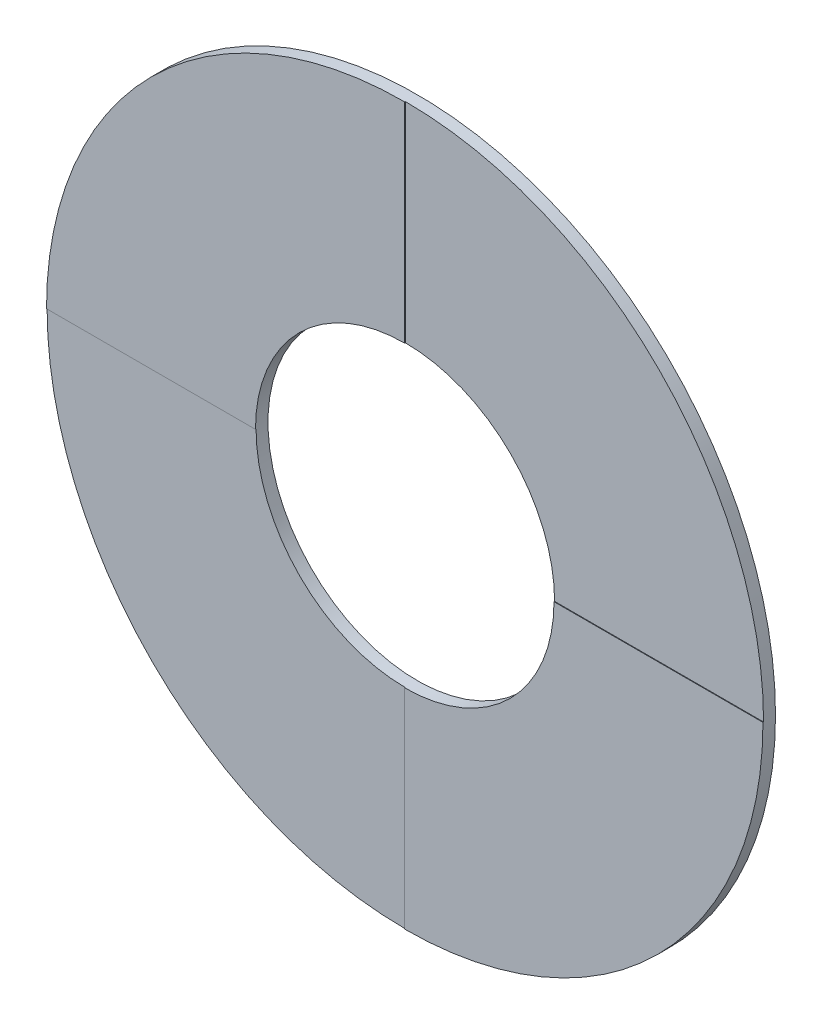
ISO-10303-21;
HEADER;
FILE_DESCRIPTION(('STEP AP214'),'2;1');
FILE_NAME('part.step','',(''),(''),'','','');
FILE_SCHEMA(('AUTOMOTIVE_DESIGN { 1 0 10303 214 1 1 1 1 }'));
ENDSEC;
DATA;
#1=APPLICATION_CONTEXT('core data for automotive mechanical design processes');
#2=APPLICATION_PROTOCOL_DEFINITION('international standard','automotive_design',2000,#1);
#3=PRODUCT_CONTEXT('',#1,'mechanical');
#4=PRODUCT('Part','Part','',(#3));
#5=PRODUCT_RELATED_PRODUCT_CATEGORY('part','',(#4));
#6=PRODUCT_DEFINITION_FORMATION('','',#4);
#7=PRODUCT_DEFINITION_CONTEXT('part definition',#1,'design');
#8=PRODUCT_DEFINITION('design','',#6,#7);
#9=PRODUCT_DEFINITION_SHAPE('','',#8);
#10=(LENGTH_UNIT() NAMED_UNIT(*) SI_UNIT(.MILLI.,.METRE.));
#11=(NAMED_UNIT(*) PLANE_ANGLE_UNIT() SI_UNIT($,.RADIAN.));
#12=(NAMED_UNIT(*) SI_UNIT($,.STERADIAN.) SOLID_ANGLE_UNIT());
#13=UNCERTAINTY_MEASURE_WITH_UNIT(LENGTH_MEASURE(1.E-05),#10,'distance_accuracy_value','');
#14=(GEOMETRIC_REPRESENTATION_CONTEXT(3) GLOBAL_UNCERTAINTY_ASSIGNED_CONTEXT((#13)) GLOBAL_UNIT_ASSIGNED_CONTEXT((#10,
#11,#12)) REPRESENTATION_CONTEXT('',''));
#15=CARTESIAN_POINT('',(0.,0.,0.));
#16=DIRECTION('',(0.,0.,1.));
#17=DIRECTION('',(1.,0.,0.));
#18=AXIS2_PLACEMENT_3D('',#15,#16,#17);
#19=CARTESIAN_POINT('',(-15.22823902556,-4.489944657592,5.5));
#20=DIRECTION('',(-1.,0.,0.));
#21=DIRECTION('',(0.,0.,1.));
#22=AXIS2_PLACEMENT_3D('',#19,#20,#21);
#23=PLANE('',#22);
#24=DIRECTION('',(0.,1.,0.));
#25=VECTOR('',#24,1.);
#26=CARTESIAN_POINT('',(-15.22823902556,0.,5.7));
#27=LINE('',#26,#25);
#28=CARTESIAN_POINT('',(-15.22823902556,-4.489944657592,5.7));
#29=VERTEX_POINT('',#28);
#30=CARTESIAN_POINT('',(-15.22823902556,-0.989944657592,5.7));
#31=VERTEX_POINT('',#30);
#32=EDGE_CURVE('E104',#29,#31,#27,.T.);
#33=ORIENTED_EDGE('',*,*,#32,.F.);
#34=DIRECTION('',(0.,0.,1.));
#35=VECTOR('',#34,1.);
#36=CARTESIAN_POINT('',(-15.22823902556,-4.489944657592,5.5));
#37=LINE('',#36,#35);
#38=CARTESIAN_POINT('',(-15.22823902556,-4.489944657592,5.71));
#39=VERTEX_POINT('',#38);
#40=EDGE_CURVE('E132',#29,#39,#37,.T.);
#41=ORIENTED_EDGE('',*,*,#40,.T.);
#42=DIRECTION('',(0.,1.,0.));
#43=VECTOR('',#42,1.);
#44=CARTESIAN_POINT('',(-15.22823902556,0.,5.71));
#45=LINE('',#44,#43);
#46=CARTESIAN_POINT('',(-15.22823902556,-0.989944657592,5.71));
#47=VERTEX_POINT('',#46);
#48=EDGE_CURVE('E124',#39,#47,#45,.T.);
#49=ORIENTED_EDGE('',*,*,#48,.T.);
#50=DIRECTION('',(0.,0.,1.));
#51=VECTOR('',#50,1.);
#52=CARTESIAN_POINT('',(-15.22823902556,-0.989944657592,5.5));
#53=LINE('',#52,#51);
#54=EDGE_CURVE('E135',#47,#31,#53,.F.);
#55=ORIENTED_EDGE('',*,*,#54,.T.);
#56=EDGE_LOOP('',(#33,#41,#49,#55));
#57=FACE_BOUND('',#56,.T.);
#58=ADVANCED_FACE('F16',(#57),#23,.T.);
#59=CARTESIAN_POINT('',(-17.72823902556,1.510055342408,5.5));
#60=DIRECTION('',(0.,-1.,0.));
#61=DIRECTION('',(0.,0.,-1.));
#62=AXIS2_PLACEMENT_3D('',#59,#60,#61);
#63=PLANE('',#62);
#64=DIRECTION('',(-1.,0.,0.));
#65=VECTOR('',#64,1.);
#66=CARTESIAN_POINT('',(0.,1.510055342408,5.71));
#67=LINE('',#66,#65);
#68=CARTESIAN_POINT('',(-17.72823902556,1.510055342408,5.71));
#69=VERTEX_POINT('',#68);
#70=CARTESIAN_POINT('',(-21.22823902556,1.510055342408,5.71));
#71=VERTEX_POINT('',#70);
#72=EDGE_CURVE('E103',#69,#71,#67,.T.);
#73=ORIENTED_EDGE('',*,*,#72,.T.);
#74=DIRECTION('',(0.,0.,-1.));
#75=VECTOR('',#74,1.);
#76=CARTESIAN_POINT('',(-21.22823902556,1.510055342408,5.5));
#77=LINE('',#76,#75);
#78=CARTESIAN_POINT('',(-21.22823902556,1.510055342408,5.7));
#79=VERTEX_POINT('',#78);
#80=EDGE_CURVE('E129',#71,#79,#77,.T.);
#81=ORIENTED_EDGE('',*,*,#80,.T.);
#82=DIRECTION('',(1.,0.,0.));
#83=VECTOR('',#82,1.);
#84=CARTESIAN_POINT('',(0.,1.510055342408,5.7));
#85=LINE('',#84,#83);
#86=CARTESIAN_POINT('',(-17.72823902556,1.510055342408,5.7));
#87=VERTEX_POINT('',#86);
#88=EDGE_CURVE('E119',#87,#79,#85,.F.);
#89=ORIENTED_EDGE('',*,*,#88,.F.);
#90=DIRECTION('',(0.,0.,-1.));
#91=VECTOR('',#90,1.);
#92=CARTESIAN_POINT('',(-17.72823902556,1.510055342408,5.5));
#93=LINE('',#92,#91);
#94=EDGE_CURVE('E78',#87,#69,#93,.F.);
#95=ORIENTED_EDGE('',*,*,#94,.T.);
#96=EDGE_LOOP('',(#73,#81,#89,#95));
#97=FACE_BOUND('',#96,.T.);
#98=ADVANCED_FACE('F244',(#97),#63,.T.);
#99=CARTESIAN_POINT('',(-15.22823902556,7.510055342408,5.5));
#100=DIRECTION('',(1.,0.,0.));
#101=DIRECTION('',(0.,0.,-1.));
#102=AXIS2_PLACEMENT_3D('',#99,#100,#101);
#103=PLANE('',#102);
#104=DIRECTION('',(0.,1.,0.));
#105=VECTOR('',#104,1.);
#106=CARTESIAN_POINT('',(-15.22823902556,0.,5.71));
#107=LINE('',#106,#105);
#108=CARTESIAN_POINT('',(-15.22823902556,7.510055342408,5.71));
#109=VERTEX_POINT('',#108);
#110=CARTESIAN_POINT('',(-15.22823902556,4.010055342408,5.71));
#111=VERTEX_POINT('',#110);
#112=EDGE_CURVE('E98',#109,#111,#107,.F.);
#113=ORIENTED_EDGE('',*,*,#112,.T.);
#114=DIRECTION('',(0.,0.,-1.));
#115=VECTOR('',#114,1.);
#116=CARTESIAN_POINT('',(-15.22823902556,4.010055342408,5.5));
#117=LINE('',#116,#115);
#118=CARTESIAN_POINT('',(-15.22823902556,4.010055342408,5.7));
#119=VERTEX_POINT('',#118);
#120=EDGE_CURVE('E84',#111,#119,#117,.T.);
#121=ORIENTED_EDGE('',*,*,#120,.T.);
#122=DIRECTION('',(0.,1.,0.));
#123=VECTOR('',#122,1.);
#124=CARTESIAN_POINT('',(-15.22823902556,0.,5.7));
#125=LINE('',#124,#123);
#126=CARTESIAN_POINT('',(-15.22823902556,7.510055342408,5.7));
#127=VERTEX_POINT('',#126);
#128=EDGE_CURVE('E109',#127,#119,#125,.F.);
#129=ORIENTED_EDGE('',*,*,#128,.F.);
#130=DIRECTION('',(0.,0.,-1.));
#131=VECTOR('',#130,1.);
#132=CARTESIAN_POINT('',(-15.22823902556,7.510055342408,5.5));
#133=LINE('',#132,#131);
#134=EDGE_CURVE('E95',#127,#109,#133,.F.);
#135=ORIENTED_EDGE('',*,*,#134,.T.);
#136=EDGE_LOOP('',(#113,#121,#129,#135));
#137=FACE_BOUND('',#136,.T.);
#138=ADVANCED_FACE('F99',(#137),#103,.T.);
#139=CARTESIAN_POINT('',(-12.72823902556,1.510055342408,5.5));
#140=DIRECTION('',(0.,1.,0.));
#141=DIRECTION('',(0.,0.,1.));
#142=AXIS2_PLACEMENT_3D('',#139,#140,#141);
#143=PLANE('',#142);
#144=DIRECTION('',(-1.,0.,0.));
#145=VECTOR('',#144,1.);
#146=CARTESIAN_POINT('',(0.,1.510055342408,5.71));
#147=LINE('',#146,#145);
#148=CARTESIAN_POINT('',(-12.72823902556,1.510055342408,5.71));
#149=VERTEX_POINT('',#148);
#150=CARTESIAN_POINT('',(-9.22823902556025,1.510055342408,5.71));
#151=VERTEX_POINT('',#150);
#152=EDGE_CURVE('E122',#149,#151,#147,.F.);
#153=ORIENTED_EDGE('',*,*,#152,.T.);
#154=DIRECTION('',(0.,0.,1.));
#155=VECTOR('',#154,1.);
#156=CARTESIAN_POINT('',(-9.2282390255605,1.510055342408,5.5));
#157=LINE('',#156,#155);
#158=CARTESIAN_POINT('',(-9.22823902556025,1.510055342408,5.7));
#159=VERTEX_POINT('',#158);
#160=EDGE_CURVE('E34',#151,#159,#157,.F.);
#161=ORIENTED_EDGE('',*,*,#160,.T.);
#162=DIRECTION('',(1.,0.,0.));
#163=VECTOR('',#162,1.);
#164=CARTESIAN_POINT('',(0.,1.510055342408,5.7));
#165=LINE('',#164,#163);
#166=CARTESIAN_POINT('',(-12.72823902556,1.510055342408,5.7));
#167=VERTEX_POINT('',#166);
#168=EDGE_CURVE('E107',#167,#159,#165,.T.);
#169=ORIENTED_EDGE('',*,*,#168,.F.);
#170=DIRECTION('',(0.,0.,1.));
#171=VECTOR('',#170,1.);
#172=CARTESIAN_POINT('',(-12.72823902556,1.510055342408,5.5));
#173=LINE('',#172,#171);
#174=EDGE_CURVE('E94',#167,#149,#173,.T.);
#175=ORIENTED_EDGE('',*,*,#174,.T.);
#176=EDGE_LOOP('',(#153,#161,#169,#175));
#177=FACE_BOUND('',#176,.T.);
#178=ADVANCED_FACE('F166',(#177),#143,.T.);
#179=CARTESIAN_POINT('',(0.,0.,5.71));
#180=DIRECTION('',(0.,0.,-1.));
#181=DIRECTION('',(-1.,0.,0.));
#182=AXIS2_PLACEMENT_3D('',#179,#180,#181);
#183=PLANE('',#182);
#184=ORIENTED_EDGE('',*,*,#152,.F.);
#185=CARTESIAN_POINT('',(-15.22823902556,1.510055342408,5.71));
#186=DIRECTION('',(0.,0.,1.));
#187=DIRECTION('',(1.,0.,0.));
#188=AXIS2_PLACEMENT_3D('',#185,#186,#187);
#189=CIRCLE('',#188,2.5);
#190=EDGE_CURVE('E108',#149,#47,#189,.F.);
#191=ORIENTED_EDGE('',*,*,#190,.T.);
#192=ORIENTED_EDGE('',*,*,#48,.F.);
#193=CARTESIAN_POINT('',(-15.22823902556,1.510055342408,5.71));
#194=DIRECTION('',(0.,0.,1.));
#195=DIRECTION('',(1.,0.,0.));
#196=AXIS2_PLACEMENT_3D('',#193,#194,#195);
#197=CIRCLE('',#196,6.);
#198=EDGE_CURVE('E146',#151,#39,#197,.F.);
#199=ORIENTED_EDGE('',*,*,#198,.F.);
#200=EDGE_LOOP('',(#184,#191,#192,#199));
#201=FACE_BOUND('',#200,.T.);
#202=ADVANCED_FACE('F157',(#201),#183,.F.);
#203=CARTESIAN_POINT('',(0.,0.,5.7));
#204=DIRECTION('',(0.,0.,1.));
#205=DIRECTION('',(1.,0.,0.));
#206=AXIS2_PLACEMENT_3D('',#203,#204,#205);
#207=PLANE('',#206);
#208=CARTESIAN_POINT('',(-15.22823902556,1.510055342408,5.7));
#209=DIRECTION('',(0.,0.,1.));
#210=DIRECTION('',(1.,0.,0.));
#211=AXIS2_PLACEMENT_3D('',#208,#209,#210);
#212=CIRCLE('',#211,6.);
#213=EDGE_CURVE('E143',#29,#79,#212,.F.);
#214=ORIENTED_EDGE('',*,*,#213,.F.);
#215=ORIENTED_EDGE('',*,*,#32,.T.);
#216=CARTESIAN_POINT('',(-15.22823902556,1.510055342408,5.7));
#217=DIRECTION('',(0.,0.,1.));
#218=DIRECTION('',(1.,0.,0.));
#219=AXIS2_PLACEMENT_3D('',#216,#217,#218);
#220=CIRCLE('',#219,2.5);
#221=EDGE_CURVE('E149',#31,#87,#220,.F.);
#222=ORIENTED_EDGE('',*,*,#221,.T.);
#223=ORIENTED_EDGE('',*,*,#88,.T.);
#224=EDGE_LOOP('',(#214,#215,#222,#223));
#225=FACE_BOUND('',#224,.T.);
#226=ADVANCED_FACE('F176',(#225),#207,.T.);
#227=CARTESIAN_POINT('',(0.,0.,5.71));
#228=DIRECTION('',(0.,0.,-1.));
#229=DIRECTION('',(-1.,0.,0.));
#230=AXIS2_PLACEMENT_3D('',#227,#228,#229);
#231=PLANE('',#230);
#232=CARTESIAN_POINT('',(-15.22823902556,1.510055342408,5.71));
#233=DIRECTION('',(0.,0.,1.));
#234=DIRECTION('',(1.,0.,0.));
#235=AXIS2_PLACEMENT_3D('',#232,#233,#234);
#236=CIRCLE('',#235,2.5);
#237=EDGE_CURVE('E19',#69,#111,#236,.F.);
#238=ORIENTED_EDGE('',*,*,#237,.T.);
#239=ORIENTED_EDGE('',*,*,#112,.F.);
#240=CARTESIAN_POINT('',(-15.22823902556,1.510055342408,5.71));
#241=DIRECTION('',(0.,0.,1.));
#242=DIRECTION('',(1.,0.,0.));
#243=AXIS2_PLACEMENT_3D('',#240,#241,#242);
#244=CIRCLE('',#243,6.);
#245=EDGE_CURVE('E141',#71,#109,#244,.F.);
#246=ORIENTED_EDGE('',*,*,#245,.F.);
#247=ORIENTED_EDGE('',*,*,#72,.F.);
#248=EDGE_LOOP('',(#238,#239,#246,#247));
#249=FACE_BOUND('',#248,.T.);
#250=ADVANCED_FACE('F106',(#249),#231,.F.);
#251=CARTESIAN_POINT('',(0.,0.,5.7));
#252=DIRECTION('',(0.,0.,1.));
#253=DIRECTION('',(1.,0.,0.));
#254=AXIS2_PLACEMENT_3D('',#251,#252,#253);
#255=PLANE('',#254);
#256=CARTESIAN_POINT('',(-15.22823902556,1.510055342408,5.7));
#257=DIRECTION('',(0.,0.,1.));
#258=DIRECTION('',(1.,0.,0.));
#259=AXIS2_PLACEMENT_3D('',#256,#257,#258);
#260=CIRCLE('',#259,2.5);
#261=EDGE_CURVE('E90',#119,#167,#260,.F.);
#262=ORIENTED_EDGE('',*,*,#261,.T.);
#263=ORIENTED_EDGE('',*,*,#168,.T.);
#264=CARTESIAN_POINT('',(-15.22823902556,1.510055342408,5.7));
#265=DIRECTION('',(0.,0.,1.));
#266=DIRECTION('',(1.,0.,0.));
#267=AXIS2_PLACEMENT_3D('',#264,#265,#266);
#268=CIRCLE('',#267,6.);
#269=EDGE_CURVE('E139',#127,#159,#268,.F.);
#270=ORIENTED_EDGE('',*,*,#269,.F.);
#271=ORIENTED_EDGE('',*,*,#128,.T.);
#272=EDGE_LOOP('',(#262,#263,#270,#271));
#273=FACE_BOUND('',#272,.T.);
#274=ADVANCED_FACE('F167',(#273),#255,.T.);
#275=CARTESIAN_POINT('',(-15.22823902556,1.510055342408,5.5));
#276=DIRECTION('',(0.,0.,1.));
#277=DIRECTION('',(1.,0.,0.));
#278=AXIS2_PLACEMENT_3D('',#275,#276,#277);
#279=CYLINDRICAL_SURFACE('',#278,2.5);
#280=ORIENTED_EDGE('',*,*,#174,.F.);
#281=ORIENTED_EDGE('',*,*,#261,.F.);
#282=ORIENTED_EDGE('',*,*,#120,.F.);
#283=ORIENTED_EDGE('',*,*,#237,.F.);
#284=ORIENTED_EDGE('',*,*,#94,.F.);
#285=ORIENTED_EDGE('',*,*,#221,.F.);
#286=ORIENTED_EDGE('',*,*,#54,.F.);
#287=ORIENTED_EDGE('',*,*,#190,.F.);
#288=EDGE_LOOP('',(#280,#281,#282,#283,#284,#285,#286,#287));
#289=FACE_BOUND('',#288,.T.);
#290=CARTESIAN_POINT('',(-15.22823902556,1.510055342408,5.5));
#291=DIRECTION('',(0.,0.,1.));
#292=DIRECTION('',(1.,0.,0.));
#293=AXIS2_PLACEMENT_3D('',#290,#291,#292);
#294=CIRCLE('',#293,2.5);
#295=CARTESIAN_POINT('',(-12.72823902556,1.510055342408,5.5));
#296=VERTEX_POINT('',#295);
#297=EDGE_CURVE('E25',#296,#296,#294,.F.);
#298=ORIENTED_EDGE('',*,*,#297,.T.);
#299=EDGE_LOOP('',(#298));
#300=FACE_BOUND('',#299,.T.);
#301=ADVANCED_FACE('F86',(#289,#300),#279,.F.);
#302=CARTESIAN_POINT('',(-15.22823902556,1.510055342408,5.5));
#303=DIRECTION('',(0.,0.,1.));
#304=DIRECTION('',(1.,0.,0.));
#305=AXIS2_PLACEMENT_3D('',#302,#303,#304);
#306=CYLINDRICAL_SURFACE('',#305,6.);
#307=ORIENTED_EDGE('',*,*,#213,.T.);
#308=ORIENTED_EDGE('',*,*,#80,.F.);
#309=ORIENTED_EDGE('',*,*,#245,.T.);
#310=ORIENTED_EDGE('',*,*,#134,.F.);
#311=ORIENTED_EDGE('',*,*,#269,.T.);
#312=ORIENTED_EDGE('',*,*,#160,.F.);
#313=ORIENTED_EDGE('',*,*,#198,.T.);
#314=ORIENTED_EDGE('',*,*,#40,.F.);
#315=EDGE_LOOP('',(#307,#308,#309,#310,#311,#312,#313,#314));
#316=FACE_BOUND('',#315,.T.);
#317=CARTESIAN_POINT('',(-15.22823902556,1.510055342408,5.5));
#318=DIRECTION('',(0.,0.,1.));
#319=DIRECTION('',(1.,0.,0.));
#320=AXIS2_PLACEMENT_3D('',#317,#318,#319);
#321=CIRCLE('',#320,6.);
#322=CARTESIAN_POINT('',(-9.22823902556,1.510055342408,5.5));
#323=VERTEX_POINT('',#322);
#324=EDGE_CURVE('E11',#323,#323,#321,.T.);
#325=ORIENTED_EDGE('',*,*,#324,.T.);
#326=EDGE_LOOP('',(#325));
#327=FACE_BOUND('',#326,.T.);
#328=ADVANCED_FACE('F164',(#316,#327),#306,.T.);
#329=CARTESIAN_POINT('',(0.,0.,5.5));
#330=DIRECTION('',(0.,0.,1.));
#331=DIRECTION('',(1.,0.,0.));
#332=AXIS2_PLACEMENT_3D('',#329,#330,#331);
#333=PLANE('',#332);
#334=ORIENTED_EDGE('',*,*,#324,.F.);
#335=EDGE_LOOP('',(#334));
#336=FACE_BOUND('',#335,.T.);
#337=ORIENTED_EDGE('',*,*,#297,.F.);
#338=EDGE_LOOP('',(#337));
#339=FACE_BOUND('',#338,.T.);
#340=ADVANCED_FACE('F178',(#336,#339),#333,.F.);
#341=CLOSED_SHELL('',(#58,#98,#138,#178,#202,#226,#250,#274,#301,#328,#340));
#342=MANIFOLD_SOLID_BREP('B1',#341);
#343=ADVANCED_BREP_SHAPE_REPRESENTATION('',(#18,#342),#14);
#344=SHAPE_DEFINITION_REPRESENTATION(#9,#343);
ENDSEC;
END-ISO-10303-21;
